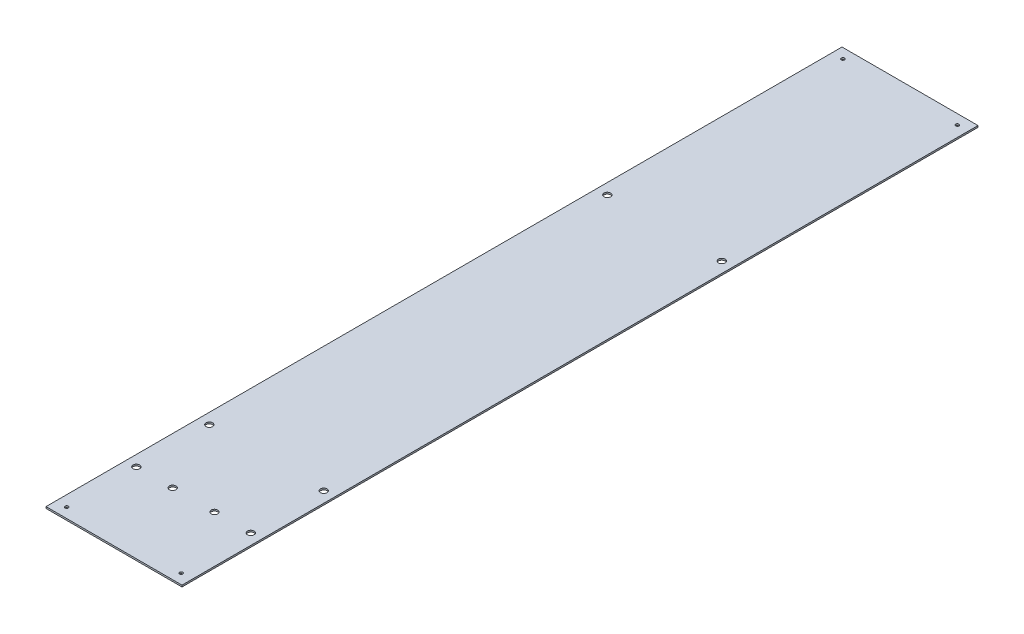
ISO-10303-21;
HEADER;
FILE_DESCRIPTION(('STEP AP214'),'2;1');
FILE_NAME('part.step','',(''),(''),'','','');
FILE_SCHEMA(('AUTOMOTIVE_DESIGN { 1 0 10303 214 1 1 1 1 }'));
ENDSEC;
DATA;
#1=APPLICATION_CONTEXT('core data for automotive mechanical design processes');
#2=APPLICATION_PROTOCOL_DEFINITION('international standard','automotive_design',2000,#1);
#3=PRODUCT_CONTEXT('',#1,'mechanical');
#4=PRODUCT('Part','Part','',(#3));
#5=PRODUCT_RELATED_PRODUCT_CATEGORY('part','',(#4));
#6=PRODUCT_DEFINITION_FORMATION('','',#4);
#7=PRODUCT_DEFINITION_CONTEXT('part definition',#1,'design');
#8=PRODUCT_DEFINITION('design','',#6,#7);
#9=PRODUCT_DEFINITION_SHAPE('','',#8);
#10=(LENGTH_UNIT() NAMED_UNIT(*) SI_UNIT(.MILLI.,.METRE.));
#11=(NAMED_UNIT(*) PLANE_ANGLE_UNIT() SI_UNIT($,.RADIAN.));
#12=(NAMED_UNIT(*) SI_UNIT($,.STERADIAN.) SOLID_ANGLE_UNIT());
#13=UNCERTAINTY_MEASURE_WITH_UNIT(LENGTH_MEASURE(1.E-05),#10,'distance_accuracy_value','');
#14=(GEOMETRIC_REPRESENTATION_CONTEXT(3) GLOBAL_UNCERTAINTY_ASSIGNED_CONTEXT((#13)) GLOBAL_UNIT_ASSIGNED_CONTEXT((#10,
#11,#12)) REPRESENTATION_CONTEXT('',''));
#15=CARTESIAN_POINT('',(0.,0.,0.));
#16=DIRECTION('',(0.,0.,1.));
#17=DIRECTION('',(1.,0.,0.));
#18=AXIS2_PLACEMENT_3D('',#15,#16,#17);
#19=CARTESIAN_POINT('',(65.0875,-1.5875,381.));
#20=DIRECTION('',(1.,0.,0.));
#21=DIRECTION('',(0.,0.,-1.));
#22=AXIS2_PLACEMENT_3D('',#19,#20,#21);
#23=PLANE('',#22);
#24=DIRECTION('',(0.,0.,-1.));
#25=VECTOR('',#24,1.);
#26=CARTESIAN_POINT('',(65.0875,0.,381.));
#27=LINE('',#26,#25);
#28=CARTESIAN_POINT('',(65.0875,0.,381.));
#29=VERTEX_POINT('',#28);
#30=CARTESIAN_POINT('',(65.0875,0.,-381.));
#31=VERTEX_POINT('',#30);
#32=EDGE_CURVE('E100',#29,#31,#27,.T.);
#33=ORIENTED_EDGE('',*,*,#32,.F.);
#34=DIRECTION('',(0.,1.,0.));
#35=VECTOR('',#34,1.);
#36=CARTESIAN_POINT('',(65.0875,-1.5875,381.));
#37=LINE('',#36,#35);
#38=CARTESIAN_POINT('',(65.0875,-1.5875,381.));
#39=VERTEX_POINT('',#38);
#40=EDGE_CURVE('E11',#39,#29,#37,.T.);
#41=ORIENTED_EDGE('',*,*,#40,.F.);
#42=DIRECTION('',(0.,0.,-1.));
#43=VECTOR('',#42,1.);
#44=CARTESIAN_POINT('',(65.0875,-1.5875,381.));
#45=LINE('',#44,#43);
#46=CARTESIAN_POINT('',(65.0875,-1.5875,-381.));
#47=VERTEX_POINT('',#46);
#48=EDGE_CURVE('E93',#39,#47,#45,.T.);
#49=ORIENTED_EDGE('',*,*,#48,.T.);
#50=DIRECTION('',(0.,1.,0.));
#51=VECTOR('',#50,1.);
#52=CARTESIAN_POINT('',(65.0875,-1.5875,-381.));
#53=LINE('',#52,#51);
#54=EDGE_CURVE('E38',#47,#31,#53,.T.);
#55=ORIENTED_EDGE('',*,*,#54,.T.);
#56=EDGE_LOOP('',(#33,#41,#49,#55));
#57=FACE_BOUND('',#56,.T.);
#58=ADVANCED_FACE('F35',(#57),#23,.T.);
#59=CARTESIAN_POINT('',(-65.0875,-1.5875,381.));
#60=DIRECTION('',(0.,0.,1.));
#61=DIRECTION('',(1.,0.,0.));
#62=AXIS2_PLACEMENT_3D('',#59,#60,#61);
#63=PLANE('',#62);
#64=DIRECTION('',(1.,0.,0.));
#65=VECTOR('',#64,1.);
#66=CARTESIAN_POINT('',(-65.0875,0.,381.));
#67=LINE('',#66,#65);
#68=CARTESIAN_POINT('',(-65.0875,0.,381.));
#69=VERTEX_POINT('',#68);
#70=EDGE_CURVE('E95',#69,#29,#67,.T.);
#71=ORIENTED_EDGE('',*,*,#70,.F.);
#72=DIRECTION('',(0.,1.,0.));
#73=VECTOR('',#72,1.);
#74=CARTESIAN_POINT('',(-65.0875,-1.5875,381.));
#75=LINE('',#74,#73);
#76=CARTESIAN_POINT('',(-65.0875,-1.5875,381.));
#77=VERTEX_POINT('',#76);
#78=EDGE_CURVE('E44',#77,#69,#75,.T.);
#79=ORIENTED_EDGE('',*,*,#78,.F.);
#80=DIRECTION('',(1.,0.,0.));
#81=VECTOR('',#80,1.);
#82=CARTESIAN_POINT('',(-65.0875,-1.5875,381.));
#83=LINE('',#82,#81);
#84=EDGE_CURVE('E90',#77,#39,#83,.T.);
#85=ORIENTED_EDGE('',*,*,#84,.T.);
#86=ORIENTED_EDGE('',*,*,#40,.T.);
#87=EDGE_LOOP('',(#71,#79,#85,#86));
#88=FACE_BOUND('',#87,.T.);
#89=ADVANCED_FACE('F111',(#88),#63,.T.);
#90=CARTESIAN_POINT('',(-65.0875,-1.5875,381.));
#91=DIRECTION('',(-1.,0.,0.));
#92=DIRECTION('',(0.,0.,1.));
#93=AXIS2_PLACEMENT_3D('',#90,#91,#92);
#94=PLANE('',#93);
#95=DIRECTION('',(0.,0.,1.));
#96=VECTOR('',#95,1.);
#97=CARTESIAN_POINT('',(-65.0875,0.,381.));
#98=LINE('',#97,#96);
#99=CARTESIAN_POINT('',(-65.0875,0.,-381.));
#100=VERTEX_POINT('',#99);
#101=EDGE_CURVE('E85',#100,#69,#98,.T.);
#102=ORIENTED_EDGE('',*,*,#101,.F.);
#103=DIRECTION('',(0.,1.,0.));
#104=VECTOR('',#103,1.);
#105=CARTESIAN_POINT('',(-65.0875,-1.5875,-381.));
#106=LINE('',#105,#104);
#107=CARTESIAN_POINT('',(-65.0875,-1.5875,-381.));
#108=VERTEX_POINT('',#107);
#109=EDGE_CURVE('E80',#108,#100,#106,.T.);
#110=ORIENTED_EDGE('',*,*,#109,.F.);
#111=DIRECTION('',(0.,0.,1.));
#112=VECTOR('',#111,1.);
#113=CARTESIAN_POINT('',(-65.0875,-1.5875,381.));
#114=LINE('',#113,#112);
#115=EDGE_CURVE('E83',#108,#77,#114,.T.);
#116=ORIENTED_EDGE('',*,*,#115,.T.);
#117=ORIENTED_EDGE('',*,*,#78,.T.);
#118=EDGE_LOOP('',(#102,#110,#116,#117));
#119=FACE_BOUND('',#118,.T.);
#120=ADVANCED_FACE('F82',(#119),#94,.T.);
#121=CARTESIAN_POINT('',(-65.0875,-1.5875,-381.));
#122=DIRECTION('',(0.,0.,-1.));
#123=DIRECTION('',(-1.,0.,0.));
#124=AXIS2_PLACEMENT_3D('',#121,#122,#123);
#125=PLANE('',#124);
#126=DIRECTION('',(-1.,0.,0.));
#127=VECTOR('',#126,1.);
#128=CARTESIAN_POINT('',(-65.0875,0.,-381.));
#129=LINE('',#128,#127);
#130=EDGE_CURVE('E103',#31,#100,#129,.T.);
#131=ORIENTED_EDGE('',*,*,#130,.F.);
#132=ORIENTED_EDGE('',*,*,#54,.F.);
#133=DIRECTION('',(-1.,0.,0.));
#134=VECTOR('',#133,1.);
#135=CARTESIAN_POINT('',(-65.0875,-1.5875,-381.));
#136=LINE('',#135,#134);
#137=EDGE_CURVE('E89',#47,#108,#136,.T.);
#138=ORIENTED_EDGE('',*,*,#137,.T.);
#139=ORIENTED_EDGE('',*,*,#109,.T.);
#140=EDGE_LOOP('',(#131,#132,#138,#139));
#141=FACE_BOUND('',#140,.T.);
#142=ADVANCED_FACE('F92',(#141),#125,.T.);
#143=CARTESIAN_POINT('',(0.,-1.5875,0.));
#144=DIRECTION('',(0.,-1.,0.));
#145=DIRECTION('',(0.,0.,-1.));
#146=AXIS2_PLACEMENT_3D('',#143,#144,#145);
#147=PLANE('',#146);
#148=CARTESIAN_POINT('',(-54.76875,-1.5875,371.475));
#149=DIRECTION('',(0.,-1.,0.));
#150=DIRECTION('',(0.,0.,1.));
#151=AXIS2_PLACEMENT_3D('',#148,#149,#150);
#152=CIRCLE('',#151,1.58749999999999);
#153=CARTESIAN_POINT('',(-54.76875,-1.5875,373.0625));
#154=VERTEX_POINT('',#153);
#155=EDGE_CURVE('E184',#154,#154,#152,.T.);
#156=ORIENTED_EDGE('',*,*,#155,.F.);
#157=EDGE_LOOP('',(#156));
#158=FACE_BOUND('',#157,.T.);
#159=CARTESIAN_POINT('',(-54.76875,-1.5875,304.8));
#160=DIRECTION('',(0.,-1.,0.));
#161=DIRECTION('',(0.,0.,1.));
#162=AXIS2_PLACEMENT_3D('',#159,#160,#161);
#163=CIRCLE('',#162,3.175);
#164=CARTESIAN_POINT('',(-54.76875,-1.5875,307.975));
#165=VERTEX_POINT('',#164);
#166=EDGE_CURVE('E203',#165,#165,#163,.T.);
#167=ORIENTED_EDGE('',*,*,#166,.F.);
#168=EDGE_LOOP('',(#167));
#169=FACE_BOUND('',#168,.T.);
#170=CARTESIAN_POINT('',(-54.76875,-1.5875,-146.05));
#171=DIRECTION('',(0.,-1.,0.));
#172=DIRECTION('',(0.,0.,1.));
#173=AXIS2_PLACEMENT_3D('',#170,#171,#172);
#174=CIRCLE('',#173,3.175);
#175=CARTESIAN_POINT('',(-54.76875,-1.5875,-142.875));
#176=VERTEX_POINT('',#175);
#177=EDGE_CURVE('E196',#176,#176,#174,.T.);
#178=ORIENTED_EDGE('',*,*,#177,.F.);
#179=EDGE_LOOP('',(#178));
#180=FACE_BOUND('',#179,.T.);
#181=CARTESIAN_POINT('',(-54.76875,-1.5875,-371.475));
#182=DIRECTION('',(0.,-1.,0.));
#183=DIRECTION('',(0.,0.,1.));
#184=AXIS2_PLACEMENT_3D('',#181,#182,#183);
#185=CIRCLE('',#184,1.5875);
#186=CARTESIAN_POINT('',(-54.76875,-1.5875,-369.8875));
#187=VERTEX_POINT('',#186);
#188=EDGE_CURVE('E212',#187,#187,#185,.T.);
#189=ORIENTED_EDGE('',*,*,#188,.F.);
#190=EDGE_LOOP('',(#189));
#191=FACE_BOUND('',#190,.T.);
#192=CARTESIAN_POINT('',(-54.76875,-1.5875,234.95));
#193=DIRECTION('',(0.,-1.,0.));
#194=DIRECTION('',(0.,0.,1.));
#195=AXIS2_PLACEMENT_3D('',#192,#193,#194);
#196=CIRCLE('',#195,3.175);
#197=CARTESIAN_POINT('',(-54.76875,-1.5875,238.125));
#198=VERTEX_POINT('',#197);
#199=EDGE_CURVE('E188',#198,#198,#196,.T.);
#200=ORIENTED_EDGE('',*,*,#199,.F.);
#201=EDGE_LOOP('',(#200));
#202=FACE_BOUND('',#201,.T.);
#203=CARTESIAN_POINT('',(-20.0000108,-1.5875,304.8));
#204=DIRECTION('',(0.,-1.,0.));
#205=DIRECTION('',(0.,0.,1.));
#206=AXIS2_PLACEMENT_3D('',#203,#204,#205);
#207=CIRCLE('',#206,3.175);
#208=CARTESIAN_POINT('',(-20.0000108,-1.5875,307.975));
#209=VERTEX_POINT('',#208);
#210=EDGE_CURVE('E208',#209,#209,#207,.T.);
#211=ORIENTED_EDGE('',*,*,#210,.F.);
#212=EDGE_LOOP('',(#211));
#213=FACE_BOUND('',#212,.T.);
#214=CARTESIAN_POINT('',(54.76875,-1.5875,371.475));
#215=DIRECTION('',(0.,1.,0.));
#216=DIRECTION('',(0.,0.,1.));
#217=AXIS2_PLACEMENT_3D('',#214,#215,#216);
#218=CIRCLE('',#217,1.58749999999999);
#219=CARTESIAN_POINT('',(54.76875,-1.5875,373.0625));
#220=VERTEX_POINT('',#219);
#221=EDGE_CURVE('E104',#220,#220,#218,.T.);
#222=ORIENTED_EDGE('',*,*,#221,.T.);
#223=EDGE_LOOP('',(#222));
#224=FACE_BOUND('',#223,.T.);
#225=CARTESIAN_POINT('',(54.76875,-1.5875,304.8));
#226=DIRECTION('',(0.,1.,0.));
#227=DIRECTION('',(0.,0.,1.));
#228=AXIS2_PLACEMENT_3D('',#225,#226,#227);
#229=CIRCLE('',#228,3.175);
#230=CARTESIAN_POINT('',(54.76875,-1.5875,307.975));
#231=VERTEX_POINT('',#230);
#232=EDGE_CURVE('E235',#231,#231,#229,.T.);
#233=ORIENTED_EDGE('',*,*,#232,.T.);
#234=EDGE_LOOP('',(#233));
#235=FACE_BOUND('',#234,.T.);
#236=CARTESIAN_POINT('',(54.76875,-1.5875,-146.05));
#237=DIRECTION('',(0.,1.,0.));
#238=DIRECTION('',(0.,0.,1.));
#239=AXIS2_PLACEMENT_3D('',#236,#237,#238);
#240=CIRCLE('',#239,3.175);
#241=CARTESIAN_POINT('',(54.76875,-1.5875,-142.875));
#242=VERTEX_POINT('',#241);
#243=EDGE_CURVE('E228',#242,#242,#240,.T.);
#244=ORIENTED_EDGE('',*,*,#243,.T.);
#245=EDGE_LOOP('',(#244));
#246=FACE_BOUND('',#245,.T.);
#247=CARTESIAN_POINT('',(54.76875,-1.5875,-371.475));
#248=DIRECTION('',(0.,1.,0.));
#249=DIRECTION('',(0.,0.,1.));
#250=AXIS2_PLACEMENT_3D('',#247,#248,#249);
#251=CIRCLE('',#250,1.5875);
#252=CARTESIAN_POINT('',(54.76875,-1.5875,-369.8875));
#253=VERTEX_POINT('',#252);
#254=EDGE_CURVE('E247',#253,#253,#251,.T.);
#255=ORIENTED_EDGE('',*,*,#254,.T.);
#256=EDGE_LOOP('',(#255));
#257=FACE_BOUND('',#256,.T.);
#258=CARTESIAN_POINT('',(54.76875,-1.5875,234.95));
#259=DIRECTION('',(0.,1.,0.));
#260=DIRECTION('',(0.,0.,1.));
#261=AXIS2_PLACEMENT_3D('',#258,#259,#260);
#262=CIRCLE('',#261,3.175);
#263=CARTESIAN_POINT('',(54.76875,-1.5875,238.125));
#264=VERTEX_POINT('',#263);
#265=EDGE_CURVE('E227',#264,#264,#262,.T.);
#266=ORIENTED_EDGE('',*,*,#265,.T.);
#267=EDGE_LOOP('',(#266));
#268=FACE_BOUND('',#267,.T.);
#269=CARTESIAN_POINT('',(20.0000108,-1.5875,304.8));
#270=DIRECTION('',(0.,1.,0.));
#271=DIRECTION('',(0.,0.,1.));
#272=AXIS2_PLACEMENT_3D('',#269,#270,#271);
#273=CIRCLE('',#272,3.175);
#274=CARTESIAN_POINT('',(20.0000108,-1.5875,307.975));
#275=VERTEX_POINT('',#274);
#276=EDGE_CURVE('E241',#275,#275,#273,.T.);
#277=ORIENTED_EDGE('',*,*,#276,.T.);
#278=EDGE_LOOP('',(#277));
#279=FACE_BOUND('',#278,.T.);
#280=ORIENTED_EDGE('',*,*,#48,.F.);
#281=ORIENTED_EDGE('',*,*,#84,.F.);
#282=ORIENTED_EDGE('',*,*,#115,.F.);
#283=ORIENTED_EDGE('',*,*,#137,.F.);
#284=EDGE_LOOP('',(#280,#281,#282,#283));
#285=FACE_BOUND('',#284,.T.);
#286=ADVANCED_FACE('F88',(#158,#169,#180,#191,#202,#213,#224,#235,#246,#257,#268,#279,#285),
#147,.T.);
#287=CARTESIAN_POINT('',(0.,0.,0.));
#288=DIRECTION('',(0.,-1.,0.));
#289=DIRECTION('',(0.,0.,-1.));
#290=AXIS2_PLACEMENT_3D('',#287,#288,#289);
#291=PLANE('',#290);
#292=CARTESIAN_POINT('',(-54.76875,0.,371.475));
#293=DIRECTION('',(0.,-1.,0.));
#294=DIRECTION('',(0.,0.,1.));
#295=AXIS2_PLACEMENT_3D('',#292,#293,#294);
#296=CIRCLE('',#295,1.58749999999999);
#297=CARTESIAN_POINT('',(-54.76875,0.,373.0625));
#298=VERTEX_POINT('',#297);
#299=EDGE_CURVE('E187',#298,#298,#296,.T.);
#300=ORIENTED_EDGE('',*,*,#299,.T.);
#301=EDGE_LOOP('',(#300));
#302=FACE_BOUND('',#301,.T.);
#303=CARTESIAN_POINT('',(-54.76875,0.,304.8));
#304=DIRECTION('',(0.,-1.,0.));
#305=DIRECTION('',(0.,0.,1.));
#306=AXIS2_PLACEMENT_3D('',#303,#304,#305);
#307=CIRCLE('',#306,3.175);
#308=CARTESIAN_POINT('',(-54.76875,0.,307.975));
#309=VERTEX_POINT('',#308);
#310=EDGE_CURVE('E206',#309,#309,#307,.T.);
#311=ORIENTED_EDGE('',*,*,#310,.T.);
#312=EDGE_LOOP('',(#311));
#313=FACE_BOUND('',#312,.T.);
#314=CARTESIAN_POINT('',(-54.76875,0.,-146.05));
#315=DIRECTION('',(0.,-1.,0.));
#316=DIRECTION('',(0.,0.,1.));
#317=AXIS2_PLACEMENT_3D('',#314,#315,#316);
#318=CIRCLE('',#317,3.175);
#319=CARTESIAN_POINT('',(-54.76875,0.,-142.875));
#320=VERTEX_POINT('',#319);
#321=EDGE_CURVE('E200',#320,#320,#318,.T.);
#322=ORIENTED_EDGE('',*,*,#321,.T.);
#323=EDGE_LOOP('',(#322));
#324=FACE_BOUND('',#323,.T.);
#325=CARTESIAN_POINT('',(-54.76875,0.,-371.475));
#326=DIRECTION('',(0.,-1.,0.));
#327=DIRECTION('',(0.,0.,1.));
#328=AXIS2_PLACEMENT_3D('',#325,#326,#327);
#329=CIRCLE('',#328,1.5875);
#330=CARTESIAN_POINT('',(-54.76875,0.,-369.8875));
#331=VERTEX_POINT('',#330);
#332=EDGE_CURVE('E199',#331,#331,#329,.T.);
#333=ORIENTED_EDGE('',*,*,#332,.T.);
#334=EDGE_LOOP('',(#333));
#335=FACE_BOUND('',#334,.T.);
#336=CARTESIAN_POINT('',(-54.76875,0.,234.95));
#337=DIRECTION('',(0.,-1.,0.));
#338=DIRECTION('',(0.,0.,1.));
#339=AXIS2_PLACEMENT_3D('',#336,#337,#338);
#340=CIRCLE('',#339,3.175);
#341=CARTESIAN_POINT('',(-54.76875,0.,238.125));
#342=VERTEX_POINT('',#341);
#343=EDGE_CURVE('E193',#342,#342,#340,.T.);
#344=ORIENTED_EDGE('',*,*,#343,.T.);
#345=EDGE_LOOP('',(#344));
#346=FACE_BOUND('',#345,.T.);
#347=CARTESIAN_POINT('',(-20.0000108,0.,304.8));
#348=DIRECTION('',(0.,-1.,0.));
#349=DIRECTION('',(0.,0.,1.));
#350=AXIS2_PLACEMENT_3D('',#347,#348,#349);
#351=CIRCLE('',#350,3.175);
#352=CARTESIAN_POINT('',(-20.0000108,0.,307.975));
#353=VERTEX_POINT('',#352);
#354=EDGE_CURVE('E219',#353,#353,#351,.T.);
#355=ORIENTED_EDGE('',*,*,#354,.T.);
#356=EDGE_LOOP('',(#355));
#357=FACE_BOUND('',#356,.T.);
#358=CARTESIAN_POINT('',(54.76875,0.,371.475));
#359=DIRECTION('',(0.,1.,0.));
#360=DIRECTION('',(0.,0.,1.));
#361=AXIS2_PLACEMENT_3D('',#358,#359,#360);
#362=CIRCLE('',#361,1.58749999999999);
#363=CARTESIAN_POINT('',(54.76875,0.,373.0625));
#364=VERTEX_POINT('',#363);
#365=EDGE_CURVE('E224',#364,#364,#362,.T.);
#366=ORIENTED_EDGE('',*,*,#365,.F.);
#367=EDGE_LOOP('',(#366));
#368=FACE_BOUND('',#367,.T.);
#369=CARTESIAN_POINT('',(54.76875,0.,304.8));
#370=DIRECTION('',(0.,1.,0.));
#371=DIRECTION('',(0.,0.,1.));
#372=AXIS2_PLACEMENT_3D('',#369,#370,#371);
#373=CIRCLE('',#372,3.175);
#374=CARTESIAN_POINT('',(54.76875,0.,307.975));
#375=VERTEX_POINT('',#374);
#376=EDGE_CURVE('E238',#375,#375,#373,.T.);
#377=ORIENTED_EDGE('',*,*,#376,.F.);
#378=EDGE_LOOP('',(#377));
#379=FACE_BOUND('',#378,.T.);
#380=CARTESIAN_POINT('',(54.76875,0.,-146.05));
#381=DIRECTION('',(0.,1.,0.));
#382=DIRECTION('',(0.,0.,1.));
#383=AXIS2_PLACEMENT_3D('',#380,#381,#382);
#384=CIRCLE('',#383,3.175);
#385=CARTESIAN_POINT('',(54.76875,0.,-142.875));
#386=VERTEX_POINT('',#385);
#387=EDGE_CURVE('E232',#386,#386,#384,.T.);
#388=ORIENTED_EDGE('',*,*,#387,.F.);
#389=EDGE_LOOP('',(#388));
#390=FACE_BOUND('',#389,.T.);
#391=CARTESIAN_POINT('',(54.76875,0.,-371.475));
#392=DIRECTION('',(0.,1.,0.));
#393=DIRECTION('',(0.,0.,1.));
#394=AXIS2_PLACEMENT_3D('',#391,#392,#393);
#395=CIRCLE('',#394,1.5875);
#396=CARTESIAN_POINT('',(54.76875,0.,-369.8875));
#397=VERTEX_POINT('',#396);
#398=EDGE_CURVE('E231',#397,#397,#395,.T.);
#399=ORIENTED_EDGE('',*,*,#398,.F.);
#400=EDGE_LOOP('',(#399));
#401=FACE_BOUND('',#400,.T.);
#402=CARTESIAN_POINT('',(54.76875,0.,234.95));
#403=DIRECTION('',(0.,1.,0.));
#404=DIRECTION('',(0.,0.,1.));
#405=AXIS2_PLACEMENT_3D('',#402,#403,#404);
#406=CIRCLE('',#405,3.175);
#407=CARTESIAN_POINT('',(54.76875,0.,238.125));
#408=VERTEX_POINT('',#407);
#409=EDGE_CURVE('E244',#408,#408,#406,.T.);
#410=ORIENTED_EDGE('',*,*,#409,.F.);
#411=EDGE_LOOP('',(#410));
#412=FACE_BOUND('',#411,.T.);
#413=CARTESIAN_POINT('',(20.0000108,0.,304.8));
#414=DIRECTION('',(0.,1.,0.));
#415=DIRECTION('',(0.,0.,1.));
#416=AXIS2_PLACEMENT_3D('',#413,#414,#415);
#417=CIRCLE('',#416,3.175);
#418=CARTESIAN_POINT('',(20.0000108,0.,307.975));
#419=VERTEX_POINT('',#418);
#420=EDGE_CURVE('E190',#419,#419,#417,.T.);
#421=ORIENTED_EDGE('',*,*,#420,.F.);
#422=EDGE_LOOP('',(#421));
#423=FACE_BOUND('',#422,.T.);
#424=ORIENTED_EDGE('',*,*,#32,.T.);
#425=ORIENTED_EDGE('',*,*,#130,.T.);
#426=ORIENTED_EDGE('',*,*,#101,.T.);
#427=ORIENTED_EDGE('',*,*,#70,.T.);
#428=EDGE_LOOP('',(#424,#425,#426,#427));
#429=FACE_BOUND('',#428,.T.);
#430=ADVANCED_FACE('F110',(#302,#313,#324,#335,#346,#357,#368,#379,#390,#401,#412,#423,#429),
#291,.F.);
#431=CARTESIAN_POINT('',(20.0000108,-1.5875,304.8));
#432=DIRECTION('',(0.,1.,0.));
#433=DIRECTION('',(0.,0.,1.));
#434=AXIS2_PLACEMENT_3D('',#431,#432,#433);
#435=CYLINDRICAL_SURFACE('',#434,3.175);
#436=ORIENTED_EDGE('',*,*,#276,.F.);
#437=EDGE_LOOP('',(#436));
#438=FACE_BOUND('',#437,.T.);
#439=ORIENTED_EDGE('',*,*,#420,.T.);
#440=EDGE_LOOP('',(#439));
#441=FACE_BOUND('',#440,.T.);
#442=ADVANCED_FACE('F129',(#438,#441),#435,.F.);
#443=CARTESIAN_POINT('',(54.76875,-1.5875,234.95));
#444=DIRECTION('',(0.,1.,0.));
#445=DIRECTION('',(0.,0.,1.));
#446=AXIS2_PLACEMENT_3D('',#443,#444,#445);
#447=CYLINDRICAL_SURFACE('',#446,3.175);
#448=ORIENTED_EDGE('',*,*,#265,.F.);
#449=EDGE_LOOP('',(#448));
#450=FACE_BOUND('',#449,.T.);
#451=ORIENTED_EDGE('',*,*,#409,.T.);
#452=EDGE_LOOP('',(#451));
#453=FACE_BOUND('',#452,.T.);
#454=ADVANCED_FACE('F136',(#450,#453),#447,.F.);
#455=CARTESIAN_POINT('',(54.76875,-1.5875,-371.475));
#456=DIRECTION('',(0.,1.,0.));
#457=DIRECTION('',(0.,0.,1.));
#458=AXIS2_PLACEMENT_3D('',#455,#456,#457);
#459=CYLINDRICAL_SURFACE('',#458,1.5875);
#460=ORIENTED_EDGE('',*,*,#254,.F.);
#461=EDGE_LOOP('',(#460));
#462=FACE_BOUND('',#461,.T.);
#463=ORIENTED_EDGE('',*,*,#398,.T.);
#464=EDGE_LOOP('',(#463));
#465=FACE_BOUND('',#464,.T.);
#466=ADVANCED_FACE('F138',(#462,#465),#459,.F.);
#467=CARTESIAN_POINT('',(54.76875,-1.5875,-146.05));
#468=DIRECTION('',(0.,1.,0.));
#469=DIRECTION('',(0.,0.,1.));
#470=AXIS2_PLACEMENT_3D('',#467,#468,#469);
#471=CYLINDRICAL_SURFACE('',#470,3.175);
#472=ORIENTED_EDGE('',*,*,#243,.F.);
#473=EDGE_LOOP('',(#472));
#474=FACE_BOUND('',#473,.T.);
#475=ORIENTED_EDGE('',*,*,#387,.T.);
#476=EDGE_LOOP('',(#475));
#477=FACE_BOUND('',#476,.T.);
#478=ADVANCED_FACE('F141',(#474,#477),#471,.F.);
#479=CARTESIAN_POINT('',(54.76875,-1.5875,304.8));
#480=DIRECTION('',(0.,1.,0.));
#481=DIRECTION('',(0.,0.,1.));
#482=AXIS2_PLACEMENT_3D('',#479,#480,#481);
#483=CYLINDRICAL_SURFACE('',#482,3.175);
#484=ORIENTED_EDGE('',*,*,#232,.F.);
#485=EDGE_LOOP('',(#484));
#486=FACE_BOUND('',#485,.T.);
#487=ORIENTED_EDGE('',*,*,#376,.T.);
#488=EDGE_LOOP('',(#487));
#489=FACE_BOUND('',#488,.T.);
#490=ADVANCED_FACE('F146',(#486,#489),#483,.F.);
#491=CARTESIAN_POINT('',(54.76875,-1.5875,371.475));
#492=DIRECTION('',(0.,1.,0.));
#493=DIRECTION('',(0.,0.,1.));
#494=AXIS2_PLACEMENT_3D('',#491,#492,#493);
#495=CYLINDRICAL_SURFACE('',#494,1.58749999999999);
#496=ORIENTED_EDGE('',*,*,#221,.F.);
#497=EDGE_LOOP('',(#496));
#498=FACE_BOUND('',#497,.T.);
#499=ORIENTED_EDGE('',*,*,#365,.T.);
#500=EDGE_LOOP('',(#499));
#501=FACE_BOUND('',#500,.T.);
#502=ADVANCED_FACE('F149',(#498,#501),#495,.F.);
#503=CARTESIAN_POINT('',(-20.0000108,-1.5875,304.8));
#504=DIRECTION('',(0.,1.,0.));
#505=DIRECTION('',(0.,0.,1.));
#506=AXIS2_PLACEMENT_3D('',#503,#504,#505);
#507=CYLINDRICAL_SURFACE('',#506,3.175);
#508=ORIENTED_EDGE('',*,*,#210,.T.);
#509=EDGE_LOOP('',(#508));
#510=FACE_BOUND('',#509,.T.);
#511=ORIENTED_EDGE('',*,*,#354,.F.);
#512=EDGE_LOOP('',(#511));
#513=FACE_BOUND('',#512,.T.);
#514=ADVANCED_FACE('F156',(#510,#513),#507,.F.);
#515=CARTESIAN_POINT('',(-54.76875,-1.5875,234.95));
#516=DIRECTION('',(0.,1.,0.));
#517=DIRECTION('',(0.,0.,1.));
#518=AXIS2_PLACEMENT_3D('',#515,#516,#517);
#519=CYLINDRICAL_SURFACE('',#518,3.175);
#520=ORIENTED_EDGE('',*,*,#199,.T.);
#521=EDGE_LOOP('',(#520));
#522=FACE_BOUND('',#521,.T.);
#523=ORIENTED_EDGE('',*,*,#343,.F.);
#524=EDGE_LOOP('',(#523));
#525=FACE_BOUND('',#524,.T.);
#526=ADVANCED_FACE('F160',(#522,#525),#519,.F.);
#527=CARTESIAN_POINT('',(-54.76875,-1.5875,-371.475));
#528=DIRECTION('',(0.,1.,0.));
#529=DIRECTION('',(0.,0.,1.));
#530=AXIS2_PLACEMENT_3D('',#527,#528,#529);
#531=CYLINDRICAL_SURFACE('',#530,1.5875);
#532=ORIENTED_EDGE('',*,*,#188,.T.);
#533=EDGE_LOOP('',(#532));
#534=FACE_BOUND('',#533,.T.);
#535=ORIENTED_EDGE('',*,*,#332,.F.);
#536=EDGE_LOOP('',(#535));
#537=FACE_BOUND('',#536,.T.);
#538=ADVANCED_FACE('F162',(#534,#537),#531,.F.);
#539=CARTESIAN_POINT('',(-54.76875,-1.5875,-146.05));
#540=DIRECTION('',(0.,1.,0.));
#541=DIRECTION('',(0.,0.,1.));
#542=AXIS2_PLACEMENT_3D('',#539,#540,#541);
#543=CYLINDRICAL_SURFACE('',#542,3.175);
#544=ORIENTED_EDGE('',*,*,#177,.T.);
#545=EDGE_LOOP('',(#544));
#546=FACE_BOUND('',#545,.T.);
#547=ORIENTED_EDGE('',*,*,#321,.F.);
#548=EDGE_LOOP('',(#547));
#549=FACE_BOUND('',#548,.T.);
#550=ADVANCED_FACE('F165',(#546,#549),#543,.F.);
#551=CARTESIAN_POINT('',(-54.76875,-1.5875,304.8));
#552=DIRECTION('',(0.,1.,0.));
#553=DIRECTION('',(0.,0.,1.));
#554=AXIS2_PLACEMENT_3D('',#551,#552,#553);
#555=CYLINDRICAL_SURFACE('',#554,3.175);
#556=ORIENTED_EDGE('',*,*,#166,.T.);
#557=EDGE_LOOP('',(#556));
#558=FACE_BOUND('',#557,.T.);
#559=ORIENTED_EDGE('',*,*,#310,.F.);
#560=EDGE_LOOP('',(#559));
#561=FACE_BOUND('',#560,.T.);
#562=ADVANCED_FACE('F170',(#558,#561),#555,.F.);
#563=CARTESIAN_POINT('',(-54.76875,-1.5875,371.475));
#564=DIRECTION('',(0.,1.,0.));
#565=DIRECTION('',(0.,0.,1.));
#566=AXIS2_PLACEMENT_3D('',#563,#564,#565);
#567=CYLINDRICAL_SURFACE('',#566,1.58749999999999);
#568=ORIENTED_EDGE('',*,*,#155,.T.);
#569=EDGE_LOOP('',(#568));
#570=FACE_BOUND('',#569,.T.);
#571=ORIENTED_EDGE('',*,*,#299,.F.);
#572=EDGE_LOOP('',(#571));
#573=FACE_BOUND('',#572,.T.);
#574=ADVANCED_FACE('F173',(#570,#573),#567,.F.);
#575=CLOSED_SHELL('',(#58,#89,#120,#142,#286,#430,#442,#454,#466,#478,#490,#502,#514,#526,#538,
#550,#562,#574));
#576=MANIFOLD_SOLID_BREP('B2',#575);
#577=ADVANCED_BREP_SHAPE_REPRESENTATION('',(#18,#576),#14);
#578=SHAPE_DEFINITION_REPRESENTATION(#9,#577);
ENDSEC;
END-ISO-10303-21;
